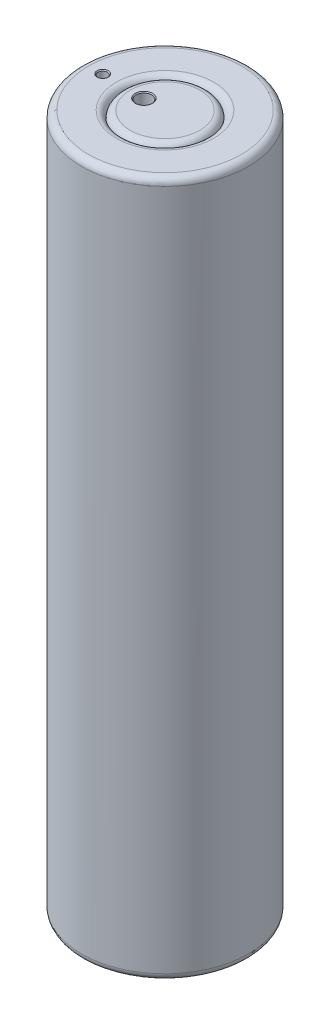
ISO-10303-21;
HEADER;
FILE_DESCRIPTION(('STEP AP214'),'2;1');
FILE_NAME('part.step','',(''),(''),'','','');
FILE_SCHEMA(('AUTOMOTIVE_DESIGN { 1 0 10303 214 1 1 1 1 }'));
ENDSEC;
DATA;
#1=APPLICATION_CONTEXT('core data for automotive mechanical design processes');
#2=APPLICATION_PROTOCOL_DEFINITION('international standard','automotive_design',2000,#1);
#3=PRODUCT_CONTEXT('',#1,'mechanical');
#4=PRODUCT('Part','Part','',(#3));
#5=PRODUCT_RELATED_PRODUCT_CATEGORY('part','',(#4));
#6=PRODUCT_DEFINITION_FORMATION('','',#4);
#7=PRODUCT_DEFINITION_CONTEXT('part definition',#1,'design');
#8=PRODUCT_DEFINITION('design','',#6,#7);
#9=PRODUCT_DEFINITION_SHAPE('','',#8);
#10=(LENGTH_UNIT() NAMED_UNIT(*) SI_UNIT(.MILLI.,.METRE.));
#11=(NAMED_UNIT(*) PLANE_ANGLE_UNIT() SI_UNIT($,.RADIAN.));
#12=(NAMED_UNIT(*) SI_UNIT($,.STERADIAN.) SOLID_ANGLE_UNIT());
#13=UNCERTAINTY_MEASURE_WITH_UNIT(LENGTH_MEASURE(1.E-05),#10,'distance_accuracy_value','');
#14=(GEOMETRIC_REPRESENTATION_CONTEXT(3) GLOBAL_UNCERTAINTY_ASSIGNED_CONTEXT((#13)) GLOBAL_UNIT_ASSIGNED_CONTEXT((#10,
#11,#12)) REPRESENTATION_CONTEXT('',''));
#15=CARTESIAN_POINT('',(0.,0.,0.));
#16=DIRECTION('',(0.,0.,1.));
#17=DIRECTION('',(1.,0.,0.));
#18=AXIS2_PLACEMENT_3D('',#15,#16,#17);
#19=CARTESIAN_POINT('',(0.,-477.667682926829,47.165975045167));
#20=DIRECTION('',(0.,1.,0.));
#21=DIRECTION('',(0.,0.,1.));
#22=AXIS2_PLACEMENT_3D('',#19,#20,#21);
#23=PLANE('',#22);
#24=CARTESIAN_POINT('',(0.,-477.667682926829,-12.834024954833));
#25=DIRECTION('',(0.,1.,0.));
#26=DIRECTION('',(0.,0.,1.));
#27=AXIS2_PLACEMENT_3D('',#24,#25,#26);
#28=CIRCLE('',#27,35.);
#29=CARTESIAN_POINT('',(0.,-477.667682926829,22.165975045167));
#30=VERTEX_POINT('',#29);
#31=EDGE_CURVE('E42',#30,#30,#28,.T.);
#32=ORIENTED_EDGE('',*,*,#31,.T.);
#33=EDGE_LOOP('',(#32));
#34=FACE_BOUND('',#33,.T.);
#35=CARTESIAN_POINT('',(0.,-477.667682926829,-12.834024954833));
#36=DIRECTION('',(0.,1.,0.));
#37=DIRECTION('',(0.,0.,1.));
#38=AXIS2_PLACEMENT_3D('',#35,#36,#37);
#39=CIRCLE('',#38,54.9999999999999);
#40=CARTESIAN_POINT('',(0.,-477.667682926829,42.165975045167));
#41=VERTEX_POINT('',#40);
#42=EDGE_CURVE('E46',#41,#41,#39,.F.);
#43=ORIENTED_EDGE('',*,*,#42,.T.);
#44=EDGE_LOOP('',(#43));
#45=FACE_BOUND('',#44,.T.);
#46=CARTESIAN_POINT('',(-44.9995193019944,-477.667682926829,-13.042021564013));
#47=DIRECTION('',(0.,-1.,0.));
#48=DIRECTION('',(0.,0.,-1.));
#49=AXIS2_PLACEMENT_3D('',#46,#47,#48);
#50=CIRCLE('',#49,7.38124);
#51=CARTESIAN_POINT('',(-44.9995193019944,-477.667682926829,-20.423261564013));
#52=VERTEX_POINT('',#51);
#53=EDGE_CURVE('E106',#52,#52,#50,.T.);
#54=ORIENTED_EDGE('',*,*,#53,.F.);
#55=EDGE_LOOP('',(#54));
#56=FACE_BOUND('',#55,.T.);
#57=CARTESIAN_POINT('',(44.9953549291329,-477.667682926829,-12.1874688463979));
#58=DIRECTION('',(0.,-1.,0.));
#59=DIRECTION('',(0.,0.,-1.));
#60=AXIS2_PLACEMENT_3D('',#57,#58,#59);
#61=CIRCLE('',#60,4.0132);
#62=CARTESIAN_POINT('',(44.9953549291329,-477.667682926829,-16.2006688463979));
#63=VERTEX_POINT('',#62);
#64=EDGE_CURVE('E133',#63,#63,#61,.T.);
#65=ORIENTED_EDGE('',*,*,#64,.F.);
#66=EDGE_LOOP('',(#65));
#67=FACE_BOUND('',#66,.T.);
#68=ADVANCED_FACE('F35',(#34,#45,#56,#67),#23,.F.);
#69=CARTESIAN_POINT('',(0.,-472.667682926829,-12.834024954833));
#70=DIRECTION('',(0.,-1.,0.));
#71=DIRECTION('',(0.,0.,-1.));
#72=AXIS2_PLACEMENT_3D('',#69,#70,#71);
#73=CYLINDRICAL_SURFACE('',#72,55.9999999999999);
#74=CARTESIAN_POINT('',(0.,-467.667682926829,-12.8340249548329));
#75=DIRECTION('',(0.,-1.,0.));
#76=DIRECTION('',(0.,0.,-1.));
#77=AXIS2_PLACEMENT_3D('',#74,#75,#76);
#78=CIRCLE('',#77,56.);
#79=CARTESIAN_POINT('',(0.,-467.667682926829,-68.8340249548329));
#80=VERTEX_POINT('',#79);
#81=EDGE_CURVE('E88',#80,#80,#78,.T.);
#82=ORIENTED_EDGE('',*,*,#81,.T.);
#83=EDGE_LOOP('',(#82));
#84=FACE_BOUND('',#83,.T.);
#85=CARTESIAN_POINT('',(0.,12.3323170731707,-12.8340249548329));
#86=DIRECTION('',(0.,-1.,0.));
#87=DIRECTION('',(0.,0.,-1.));
#88=AXIS2_PLACEMENT_3D('',#85,#86,#87);
#89=CIRCLE('',#88,55.9999999999999);
#90=CARTESIAN_POINT('',(0.,12.3323170731707,-68.8340249548328));
#91=VERTEX_POINT('',#90);
#92=EDGE_CURVE('E79',#91,#91,#89,.T.);
#93=ORIENTED_EDGE('',*,*,#92,.F.);
#94=EDGE_LOOP('',(#93));
#95=FACE_BOUND('',#94,.T.);
#96=ADVANCED_FACE('F140',(#84,#95),#73,.F.);
#97=CARTESIAN_POINT('',(0.,12.3323170731707,43.1659750451671));
#98=DIRECTION('',(0.,-1.,0.));
#99=DIRECTION('',(0.,0.,-1.));
#100=AXIS2_PLACEMENT_3D('',#97,#98,#99);
#101=PLANE('',#100);
#102=CARTESIAN_POINT('',(-44.9995193019944,12.3323170731707,-13.0420215640129));
#103=DIRECTION('',(0.,-1.,0.));
#104=DIRECTION('',(0.,0.,-1.));
#105=AXIS2_PLACEMENT_3D('',#102,#103,#104);
#106=CIRCLE('',#105,3.3782);
#107=CARTESIAN_POINT('',(-44.9995193019944,12.3323170731707,-16.4202215640129));
#108=VERTEX_POINT('',#107);
#109=EDGE_CURVE('E118',#108,#108,#106,.T.);
#110=ORIENTED_EDGE('',*,*,#109,.F.);
#111=EDGE_LOOP('',(#110));
#112=FACE_BOUND('',#111,.T.);
#113=ORIENTED_EDGE('',*,*,#92,.T.);
#114=EDGE_LOOP('',(#113));
#115=FACE_BOUND('',#114,.T.);
#116=CARTESIAN_POINT('',(0.,12.3323170731707,-12.8340249548329));
#117=DIRECTION('',(0.,-1.,0.));
#118=DIRECTION('',(0.,0.,-1.));
#119=AXIS2_PLACEMENT_3D('',#116,#117,#118);
#120=CIRCLE('',#119,34.);
#121=CARTESIAN_POINT('',(0.,12.3323170731707,-46.8340249548329));
#122=VERTEX_POINT('',#121);
#123=EDGE_CURVE('E82',#122,#122,#120,.T.);
#124=ORIENTED_EDGE('',*,*,#123,.F.);
#125=EDGE_LOOP('',(#124));
#126=FACE_BOUND('',#125,.T.);
#127=ADVANCED_FACE('F145',(#112,#115,#126),#101,.T.);
#128=CARTESIAN_POINT('',(0.,-472.667682926829,-12.834024954833));
#129=DIRECTION('',(0.,-1.,0.));
#130=DIRECTION('',(0.,0.,-1.));
#131=AXIS2_PLACEMENT_3D('',#128,#129,#130);
#132=CYLINDRICAL_SURFACE('',#131,34.);
#133=ORIENTED_EDGE('',*,*,#123,.T.);
#134=EDGE_LOOP('',(#133));
#135=FACE_BOUND('',#134,.T.);
#136=CARTESIAN_POINT('',(0.,-467.667682926829,-12.8340249548329));
#137=DIRECTION('',(0.,-1.,0.));
#138=DIRECTION('',(0.,0.,-1.));
#139=AXIS2_PLACEMENT_3D('',#136,#137,#138);
#140=CIRCLE('',#139,34.);
#141=CARTESIAN_POINT('',(0.,-467.667682926829,-46.834024954833));
#142=VERTEX_POINT('',#141);
#143=EDGE_CURVE('E85',#142,#142,#140,.T.);
#144=ORIENTED_EDGE('',*,*,#143,.F.);
#145=EDGE_LOOP('',(#144));
#146=FACE_BOUND('',#145,.T.);
#147=ADVANCED_FACE('F236',(#135,#146),#132,.T.);
#148=CARTESIAN_POINT('',(0.,-467.667682926829,43.165975045167));
#149=DIRECTION('',(0.,1.,0.));
#150=DIRECTION('',(0.,0.,1.));
#151=AXIS2_PLACEMENT_3D('',#148,#149,#150);
#152=PLANE('',#151);
#153=CARTESIAN_POINT('',(44.9953549291329,-467.667682926829,-12.1874688463979));
#154=DIRECTION('',(0.,1.,0.));
#155=DIRECTION('',(0.,0.,1.));
#156=AXIS2_PLACEMENT_3D('',#153,#154,#155);
#157=CIRCLE('',#156,3.3782);
#158=CARTESIAN_POINT('',(44.9953549291329,-467.667682926829,-8.80926884639788));
#159=VERTEX_POINT('',#158);
#160=EDGE_CURVE('E127',#159,#159,#157,.T.);
#161=ORIENTED_EDGE('',*,*,#160,.F.);
#162=EDGE_LOOP('',(#161));
#163=FACE_BOUND('',#162,.T.);
#164=CARTESIAN_POINT('',(-44.9995193019944,-467.667682926829,-13.042021564013));
#165=DIRECTION('',(0.,1.,0.));
#166=DIRECTION('',(0.,0.,1.));
#167=AXIS2_PLACEMENT_3D('',#164,#165,#166);
#168=CIRCLE('',#167,6.74624);
#169=CARTESIAN_POINT('',(-44.9995193019944,-467.667682926829,-6.29578156401303));
#170=VERTEX_POINT('',#169);
#171=EDGE_CURVE('E100',#170,#170,#168,.T.);
#172=ORIENTED_EDGE('',*,*,#171,.F.);
#173=EDGE_LOOP('',(#172));
#174=FACE_BOUND('',#173,.T.);
#175=ORIENTED_EDGE('',*,*,#143,.T.);
#176=EDGE_LOOP('',(#175));
#177=FACE_BOUND('',#176,.T.);
#178=ORIENTED_EDGE('',*,*,#81,.F.);
#179=EDGE_LOOP('',(#178));
#180=FACE_BOUND('',#179,.T.);
#181=ADVANCED_FACE('F222',(#163,#174,#177,#180),#152,.T.);
#182=CARTESIAN_POINT('',(-44.9995193019944,-477.667682926829,-13.042021564013));
#183=DIRECTION('',(0.,-1.,0.));
#184=DIRECTION('',(0.,0.,-1.));
#185=AXIS2_PLACEMENT_3D('',#182,#183,#184);
#186=CYLINDRICAL_SURFACE('',#185,6.74624);
#187=CARTESIAN_POINT('',(-44.9995193019944,-477.032682926829,-13.042021564013));
#188=DIRECTION('',(0.,-1.,0.));
#189=DIRECTION('',(0.,0.,-1.));
#190=AXIS2_PLACEMENT_3D('',#187,#188,#189);
#191=CIRCLE('',#190,6.74624);
#192=CARTESIAN_POINT('',(-44.9995193019944,-477.032682926829,-19.788261564013));
#193=VERTEX_POINT('',#192);
#194=EDGE_CURVE('E103',#193,#193,#191,.T.);
#195=ORIENTED_EDGE('',*,*,#194,.T.);
#196=EDGE_LOOP('',(#195));
#197=FACE_BOUND('',#196,.T.);
#198=ORIENTED_EDGE('',*,*,#171,.T.);
#199=EDGE_LOOP('',(#198));
#200=FACE_BOUND('',#199,.T.);
#201=ADVANCED_FACE('F216',(#197,#200),#186,.F.);
#202=CARTESIAN_POINT('',(-44.9995193019944,-477.667682926829,-13.042021564013));
#203=DIRECTION('',(0.,-1.,0.));
#204=DIRECTION('',(0.,0.,-1.));
#205=AXIS2_PLACEMENT_3D('',#202,#203,#204);
#206=CONICAL_SURFACE('',#205,7.38124,0.785398163397448);
#207=ORIENTED_EDGE('',*,*,#194,.F.);
#208=EDGE_LOOP('',(#207));
#209=FACE_BOUND('',#208,.T.);
#210=ORIENTED_EDGE('',*,*,#53,.T.);
#211=EDGE_LOOP('',(#210));
#212=FACE_BOUND('',#211,.T.);
#213=ADVANCED_FACE('F173',(#209,#212),#206,.F.);
#214=CARTESIAN_POINT('',(0.,-467.667682926829,-12.8340249548329));
#215=DIRECTION('',(0.,1.,0.));
#216=DIRECTION('',(0.,0.,1.));
#217=AXIS2_PLACEMENT_3D('',#214,#215,#216);
#218=PLANE('',#217);
#219=CARTESIAN_POINT('',(-14.9984516430443,-467.667682926829,-13.0495436576446));
#220=DIRECTION('',(0.,1.,0.));
#221=DIRECTION('',(0.,0.,1.));
#222=AXIS2_PLACEMENT_3D('',#219,#220,#221);
#223=CIRCLE('',#222,5.5626);
#224=CARTESIAN_POINT('',(-14.9984516430443,-467.667682926829,-7.48694365764464));
#225=VERTEX_POINT('',#224);
#226=EDGE_CURVE('E109',#225,#225,#223,.T.);
#227=ORIENTED_EDGE('',*,*,#226,.F.);
#228=EDGE_LOOP('',(#227));
#229=FACE_BOUND('',#228,.T.);
#230=CARTESIAN_POINT('',(0.,-467.667682926829,-12.8340249548329));
#231=DIRECTION('',(0.,1.,0.));
#232=DIRECTION('',(0.,0.,1.));
#233=AXIS2_PLACEMENT_3D('',#230,#231,#232);
#234=CIRCLE('',#233,26.);
#235=CARTESIAN_POINT('',(0.,-467.667682926829,13.165975045167));
#236=VERTEX_POINT('',#235);
#237=EDGE_CURVE('E73',#236,#236,#234,.T.);
#238=ORIENTED_EDGE('',*,*,#237,.T.);
#239=EDGE_LOOP('',(#238));
#240=FACE_BOUND('',#239,.T.);
#241=ADVANCED_FACE('F169',(#229,#240),#218,.T.);
#242=CARTESIAN_POINT('',(0.,-467.667682926829,-12.8340249548329));
#243=DIRECTION('',(0.,1.,0.));
#244=DIRECTION('',(0.,0.,1.));
#245=AXIS2_PLACEMENT_3D('',#242,#243,#244);
#246=CYLINDRICAL_SURFACE('',#245,26.);
#247=CARTESIAN_POINT('',(0.,12.3323170731707,-12.8340249548329));
#248=DIRECTION('',(0.,1.,0.));
#249=DIRECTION('',(0.,0.,1.));
#250=AXIS2_PLACEMENT_3D('',#247,#248,#249);
#251=CIRCLE('',#250,26.);
#252=CARTESIAN_POINT('',(0.,12.3323170731707,13.1659750451671));
#253=VERTEX_POINT('',#252);
#254=EDGE_CURVE('E76',#253,#253,#251,.T.);
#255=ORIENTED_EDGE('',*,*,#254,.T.);
#256=EDGE_LOOP('',(#255));
#257=FACE_BOUND('',#256,.T.);
#258=ORIENTED_EDGE('',*,*,#237,.F.);
#259=EDGE_LOOP('',(#258));
#260=FACE_BOUND('',#259,.T.);
#261=ADVANCED_FACE('F165',(#257,#260),#246,.F.);
#262=CARTESIAN_POINT('',(0.,12.3323170731707,-12.8340249548329));
#263=DIRECTION('',(0.,-1.,0.));
#264=DIRECTION('',(0.,0.,-1.));
#265=AXIS2_PLACEMENT_3D('',#262,#263,#264);
#266=PLANE('',#265);
#267=CARTESIAN_POINT('',(-14.9989517782276,12.3323170731707,-12.656696010766));
#268=DIRECTION('',(0.,-1.,0.));
#269=DIRECTION('',(0.,0.,-1.));
#270=AXIS2_PLACEMENT_3D('',#267,#268,#269);
#271=CIRCLE('',#270,5.5626);
#272=CARTESIAN_POINT('',(-14.9989517782276,12.3323170731707,-18.219296010766));
#273=VERTEX_POINT('',#272);
#274=EDGE_CURVE('E91',#273,#273,#271,.T.);
#275=ORIENTED_EDGE('',*,*,#274,.F.);
#276=EDGE_LOOP('',(#275));
#277=FACE_BOUND('',#276,.T.);
#278=ORIENTED_EDGE('',*,*,#254,.F.);
#279=EDGE_LOOP('',(#278));
#280=FACE_BOUND('',#279,.T.);
#281=ADVANCED_FACE('F161',(#277,#280),#266,.T.);
#282=CARTESIAN_POINT('',(-14.9989517782276,22.3323170731707,-12.656696010766));
#283=DIRECTION('',(0.,1.,0.));
#284=DIRECTION('',(0.,0.,1.));
#285=AXIS2_PLACEMENT_3D('',#282,#283,#284);
#286=CYLINDRICAL_SURFACE('',#285,5.5626);
#287=CARTESIAN_POINT('',(-14.9989517782276,21.6973170731707,-12.656696010766));
#288=DIRECTION('',(0.,1.,0.));
#289=DIRECTION('',(0.,0.,1.));
#290=AXIS2_PLACEMENT_3D('',#287,#288,#289);
#291=CIRCLE('',#290,5.5626);
#292=CARTESIAN_POINT('',(-14.9989517782276,21.6973170731707,-7.09409601076597));
#293=VERTEX_POINT('',#292);
#294=EDGE_CURVE('E94',#293,#293,#291,.T.);
#295=ORIENTED_EDGE('',*,*,#294,.T.);
#296=EDGE_LOOP('',(#295));
#297=FACE_BOUND('',#296,.T.);
#298=ORIENTED_EDGE('',*,*,#274,.T.);
#299=EDGE_LOOP('',(#298));
#300=FACE_BOUND('',#299,.T.);
#301=ADVANCED_FACE('F164',(#297,#300),#286,.F.);
#302=CARTESIAN_POINT('',(-14.9989517782276,22.3323170731707,-12.656696010766));
#303=DIRECTION('',(0.,1.,0.));
#304=DIRECTION('',(0.,0.,1.));
#305=AXIS2_PLACEMENT_3D('',#302,#303,#304);
#306=CONICAL_SURFACE('',#305,6.1976,0.785398163397451);
#307=ORIENTED_EDGE('',*,*,#294,.F.);
#308=EDGE_LOOP('',(#307));
#309=FACE_BOUND('',#308,.T.);
#310=CARTESIAN_POINT('',(-14.9989517782276,22.3323170731707,-12.656696010766));
#311=DIRECTION('',(0.,1.,0.));
#312=DIRECTION('',(0.,0.,1.));
#313=AXIS2_PLACEMENT_3D('',#310,#311,#312);
#314=CIRCLE('',#313,6.1976);
#315=CARTESIAN_POINT('',(-14.9989517782276,22.3323170731707,-6.45909601076597));
#316=VERTEX_POINT('',#315);
#317=EDGE_CURVE('E97',#316,#316,#314,.T.);
#318=ORIENTED_EDGE('',*,*,#317,.T.);
#319=EDGE_LOOP('',(#318));
#320=FACE_BOUND('',#319,.T.);
#321=ADVANCED_FACE('F159',(#309,#320),#306,.F.);
#322=CARTESIAN_POINT('',(0.,22.3323170731707,17.1659750451671));
#323=DIRECTION('',(0.,1.,0.));
#324=DIRECTION('',(0.,0.,1.));
#325=AXIS2_PLACEMENT_3D('',#322,#323,#324);
#326=PLANE('',#325);
#327=ORIENTED_EDGE('',*,*,#317,.F.);
#328=EDGE_LOOP('',(#327));
#329=FACE_BOUND('',#328,.T.);
#330=CARTESIAN_POINT('',(0.,22.3323170731707,-12.8340249548329));
#331=DIRECTION('',(0.,1.,0.));
#332=DIRECTION('',(0.,0.,1.));
#333=AXIS2_PLACEMENT_3D('',#330,#331,#332);
#334=CIRCLE('',#333,25.);
#335=CARTESIAN_POINT('',(0.,22.3323170731707,12.1659750451671));
#336=VERTEX_POINT('',#335);
#337=EDGE_CURVE('E70',#336,#336,#334,.T.);
#338=ORIENTED_EDGE('',*,*,#337,.T.);
#339=EDGE_LOOP('',(#338));
#340=FACE_BOUND('',#339,.T.);
#341=ADVANCED_FACE('F156',(#329,#340),#326,.T.);
#342=CARTESIAN_POINT('',(0.,17.3323170731707,-12.8340249548329));
#343=DIRECTION('',(0.,1.,0.));
#344=DIRECTION('',(0.,0.,1.));
#345=AXIS2_PLACEMENT_3D('',#342,#343,#344);
#346=TOROIDAL_SURFACE('',#345,25.,5.);
#347=CARTESIAN_POINT('',(0.,17.3323170731707,-12.8340249548329));
#348=DIRECTION('',(0.,1.,0.));
#349=DIRECTION('',(0.,0.,1.));
#350=AXIS2_PLACEMENT_3D('',#347,#348,#349);
#351=CIRCLE('',#350,30.);
#352=CARTESIAN_POINT('',(0.,17.3323170731707,17.1659750451671));
#353=VERTEX_POINT('',#352);
#354=EDGE_CURVE('E67',#353,#353,#351,.F.);
#355=ORIENTED_EDGE('',*,*,#354,.F.);
#356=EDGE_LOOP('',(#355));
#357=FACE_BOUND('',#356,.T.);
#358=ORIENTED_EDGE('',*,*,#337,.F.);
#359=EDGE_LOOP('',(#358));
#360=FACE_BOUND('',#359,.T.);
#361=ADVANCED_FACE('F155',(#357,#360),#346,.T.);
#362=CARTESIAN_POINT('',(0.,-472.667682926829,-12.834024954833));
#363=DIRECTION('',(0.,-1.,0.));
#364=DIRECTION('',(0.,0.,-1.));
#365=AXIS2_PLACEMENT_3D('',#362,#363,#364);
#366=CYLINDRICAL_SURFACE('',#365,59.9999999999999);
#367=CARTESIAN_POINT('',(0.,-472.667682926829,-12.834024954833));
#368=DIRECTION('',(0.,1.,0.));
#369=DIRECTION('',(0.,0.,1.));
#370=AXIS2_PLACEMENT_3D('',#367,#368,#369);
#371=CIRCLE('',#370,59.9999999999999);
#372=CARTESIAN_POINT('',(0.,-472.667682926829,47.165975045167));
#373=VERTEX_POINT('',#372);
#374=EDGE_CURVE('E10',#373,#373,#371,.T.);
#375=ORIENTED_EDGE('',*,*,#374,.T.);
#376=EDGE_LOOP('',(#375));
#377=FACE_BOUND('',#376,.T.);
#378=CARTESIAN_POINT('',(0.,17.3323170731707,-12.8340249548329));
#379=DIRECTION('',(0.,-1.,0.));
#380=DIRECTION('',(0.,0.,-1.));
#381=AXIS2_PLACEMENT_3D('',#378,#379,#380);
#382=CIRCLE('',#381,59.9999999999999);
#383=CARTESIAN_POINT('',(0.,17.3323170731707,-72.8340249548328));
#384=VERTEX_POINT('',#383);
#385=EDGE_CURVE('E58',#384,#384,#382,.T.);
#386=ORIENTED_EDGE('',*,*,#385,.T.);
#387=EDGE_LOOP('',(#386));
#388=FACE_BOUND('',#387,.T.);
#389=ADVANCED_FACE('F152',(#377,#388),#366,.T.);
#390=CARTESIAN_POINT('',(0.,22.3323170731707,47.1659750451671));
#391=DIRECTION('',(0.,-1.,0.));
#392=DIRECTION('',(0.,0.,-1.));
#393=AXIS2_PLACEMENT_3D('',#390,#391,#392);
#394=PLANE('',#393);
#395=CARTESIAN_POINT('',(-44.9995193019944,22.3323170731707,-13.0420215640129));
#396=DIRECTION('',(0.,1.,0.));
#397=DIRECTION('',(0.,0.,1.));
#398=AXIS2_PLACEMENT_3D('',#395,#396,#397);
#399=CIRCLE('',#398,4.0132);
#400=CARTESIAN_POINT('',(-44.9995193019944,22.3323170731707,-9.02882156401294));
#401=VERTEX_POINT('',#400);
#402=EDGE_CURVE('E124',#401,#401,#399,.T.);
#403=ORIENTED_EDGE('',*,*,#402,.F.);
#404=EDGE_LOOP('',(#403));
#405=FACE_BOUND('',#404,.T.);
#406=CARTESIAN_POINT('',(0.,22.3323170731707,-12.8340249548329));
#407=DIRECTION('',(0.,-1.,0.));
#408=DIRECTION('',(0.,0.,-1.));
#409=AXIS2_PLACEMENT_3D('',#406,#407,#408);
#410=CIRCLE('',#409,54.9999999999999);
#411=CARTESIAN_POINT('',(0.,22.3323170731707,-67.8340249548328));
#412=VERTEX_POINT('',#411);
#413=EDGE_CURVE('E50',#412,#412,#410,.F.);
#414=ORIENTED_EDGE('',*,*,#413,.T.);
#415=EDGE_LOOP('',(#414));
#416=FACE_BOUND('',#415,.T.);
#417=CARTESIAN_POINT('',(0.,22.3323170731707,-12.8340249548329));
#418=DIRECTION('',(0.,-1.,0.));
#419=DIRECTION('',(0.,0.,-1.));
#420=AXIS2_PLACEMENT_3D('',#417,#418,#419);
#421=CIRCLE('',#420,35.);
#422=CARTESIAN_POINT('',(0.,22.3323170731707,-47.8340249548329));
#423=VERTEX_POINT('',#422);
#424=EDGE_CURVE('E55',#423,#423,#421,.T.);
#425=ORIENTED_EDGE('',*,*,#424,.T.);
#426=EDGE_LOOP('',(#425));
#427=FACE_BOUND('',#426,.T.);
#428=ADVANCED_FACE('F151',(#405,#416,#427),#394,.F.);
#429=CARTESIAN_POINT('',(0.,-477.667682926829,17.165975045167));
#430=DIRECTION('',(0.,-1.,0.));
#431=DIRECTION('',(0.,0.,-1.));
#432=AXIS2_PLACEMENT_3D('',#429,#430,#431);
#433=PLANE('',#432);
#434=CARTESIAN_POINT('',(-14.9984516430443,-477.667682926829,-13.0495436576446));
#435=DIRECTION('',(0.,-1.,0.));
#436=DIRECTION('',(0.,0.,-1.));
#437=AXIS2_PLACEMENT_3D('',#434,#435,#436);
#438=CIRCLE('',#437,6.1976);
#439=CARTESIAN_POINT('',(-14.9984516430443,-477.667682926829,-19.2471436576446));
#440=VERTEX_POINT('',#439);
#441=EDGE_CURVE('E115',#440,#440,#438,.T.);
#442=ORIENTED_EDGE('',*,*,#441,.F.);
#443=EDGE_LOOP('',(#442));
#444=FACE_BOUND('',#443,.T.);
#445=CARTESIAN_POINT('',(0.,-477.667682926829,-12.8340249548329));
#446=DIRECTION('',(0.,-1.,0.));
#447=DIRECTION('',(0.,0.,-1.));
#448=AXIS2_PLACEMENT_3D('',#445,#446,#447);
#449=CIRCLE('',#448,25.);
#450=CARTESIAN_POINT('',(0.,-477.667682926829,-37.8340249548329));
#451=VERTEX_POINT('',#450);
#452=EDGE_CURVE('E61',#451,#451,#449,.T.);
#453=ORIENTED_EDGE('',*,*,#452,.T.);
#454=EDGE_LOOP('',(#453));
#455=FACE_BOUND('',#454,.T.);
#456=ADVANCED_FACE('F175',(#444,#455),#433,.T.);
#457=CARTESIAN_POINT('',(0.,-472.667682926829,-12.8340249548329));
#458=DIRECTION('',(0.,-1.,0.));
#459=DIRECTION('',(0.,0.,-1.));
#460=AXIS2_PLACEMENT_3D('',#457,#458,#459);
#461=TOROIDAL_SURFACE('',#460,25.,5.);
#462=ORIENTED_EDGE('',*,*,#452,.F.);
#463=EDGE_LOOP('',(#462));
#464=FACE_BOUND('',#463,.T.);
#465=CARTESIAN_POINT('',(0.,-472.667682926829,-12.8340249548329));
#466=DIRECTION('',(0.,-1.,0.));
#467=DIRECTION('',(0.,0.,-1.));
#468=AXIS2_PLACEMENT_3D('',#465,#466,#467);
#469=CIRCLE('',#468,30.);
#470=CARTESIAN_POINT('',(0.,-472.667682926829,-42.8340249548329));
#471=VERTEX_POINT('',#470);
#472=EDGE_CURVE('E64',#471,#471,#469,.F.);
#473=ORIENTED_EDGE('',*,*,#472,.F.);
#474=EDGE_LOOP('',(#473));
#475=FACE_BOUND('',#474,.T.);
#476=ADVANCED_FACE('F178',(#464,#475),#461,.T.);
#477=CARTESIAN_POINT('',(0.,17.3323170731707,-12.8340249548329));
#478=DIRECTION('',(0.,-1.,0.));
#479=DIRECTION('',(0.,0.,-1.));
#480=AXIS2_PLACEMENT_3D('',#477,#478,#479);
#481=TOROIDAL_SURFACE('',#480,54.9999999999999,5.);
#482=ORIENTED_EDGE('',*,*,#413,.F.);
#483=EDGE_LOOP('',(#482));
#484=FACE_BOUND('',#483,.T.);
#485=ORIENTED_EDGE('',*,*,#385,.F.);
#486=EDGE_LOOP('',(#485));
#487=FACE_BOUND('',#486,.T.);
#488=ADVANCED_FACE('F185',(#484,#487),#481,.T.);
#489=CARTESIAN_POINT('',(0.,17.3323170731707,-12.8340249548329));
#490=DIRECTION('',(0.,-1.,0.));
#491=DIRECTION('',(0.,0.,-1.));
#492=AXIS2_PLACEMENT_3D('',#489,#490,#491);
#493=TOROIDAL_SURFACE('',#492,35.,5.);
#494=ORIENTED_EDGE('',*,*,#354,.T.);
#495=EDGE_LOOP('',(#494));
#496=FACE_BOUND('',#495,.T.);
#497=ORIENTED_EDGE('',*,*,#424,.F.);
#498=EDGE_LOOP('',(#497));
#499=FACE_BOUND('',#498,.T.);
#500=ADVANCED_FACE('F189',(#496,#499),#493,.T.);
#501=CARTESIAN_POINT('',(0.,-472.667682926829,-12.834024954833));
#502=DIRECTION('',(0.,1.,0.));
#503=DIRECTION('',(0.,0.,1.));
#504=AXIS2_PLACEMENT_3D('',#501,#502,#503);
#505=TOROIDAL_SURFACE('',#504,35.,5.);
#506=ORIENTED_EDGE('',*,*,#31,.F.);
#507=EDGE_LOOP('',(#506));
#508=FACE_BOUND('',#507,.T.);
#509=ORIENTED_EDGE('',*,*,#472,.T.);
#510=EDGE_LOOP('',(#509));
#511=FACE_BOUND('',#510,.T.);
#512=ADVANCED_FACE('F192',(#508,#511),#505,.T.);
#513=CARTESIAN_POINT('',(0.,-472.667682926829,-12.834024954833));
#514=DIRECTION('',(0.,1.,0.));
#515=DIRECTION('',(0.,0.,1.));
#516=AXIS2_PLACEMENT_3D('',#513,#514,#515);
#517=TOROIDAL_SURFACE('',#516,54.9999999999999,5.);
#518=ORIENTED_EDGE('',*,*,#374,.F.);
#519=EDGE_LOOP('',(#518));
#520=FACE_BOUND('',#519,.T.);
#521=ORIENTED_EDGE('',*,*,#42,.F.);
#522=EDGE_LOOP('',(#521));
#523=FACE_BOUND('',#522,.T.);
#524=ADVANCED_FACE('F37',(#520,#523),#517,.T.);
#525=CARTESIAN_POINT('',(-14.9984516430443,-477.667682926829,-13.0495436576446));
#526=DIRECTION('',(0.,-1.,0.));
#527=DIRECTION('',(0.,0.,-1.));
#528=AXIS2_PLACEMENT_3D('',#525,#526,#527);
#529=CYLINDRICAL_SURFACE('',#528,5.5626);
#530=CARTESIAN_POINT('',(-14.9984516430443,-477.032682926829,-13.0495436576446));
#531=DIRECTION('',(0.,-1.,0.));
#532=DIRECTION('',(0.,0.,-1.));
#533=AXIS2_PLACEMENT_3D('',#530,#531,#532);
#534=CIRCLE('',#533,5.5626);
#535=CARTESIAN_POINT('',(-14.9984516430443,-477.032682926829,-18.6121436576446));
#536=VERTEX_POINT('',#535);
#537=EDGE_CURVE('E112',#536,#536,#534,.T.);
#538=ORIENTED_EDGE('',*,*,#537,.T.);
#539=EDGE_LOOP('',(#538));
#540=FACE_BOUND('',#539,.T.);
#541=ORIENTED_EDGE('',*,*,#226,.T.);
#542=EDGE_LOOP('',(#541));
#543=FACE_BOUND('',#542,.T.);
#544=ADVANCED_FACE('F199',(#540,#543),#529,.F.);
#545=CARTESIAN_POINT('',(-14.9984516430443,-477.667682926829,-13.0495436576446));
#546=DIRECTION('',(0.,-1.,0.));
#547=DIRECTION('',(0.,0.,-1.));
#548=AXIS2_PLACEMENT_3D('',#545,#546,#547);
#549=CONICAL_SURFACE('',#548,6.1976,0.785398163397451);
#550=ORIENTED_EDGE('',*,*,#537,.F.);
#551=EDGE_LOOP('',(#550));
#552=FACE_BOUND('',#551,.T.);
#553=ORIENTED_EDGE('',*,*,#441,.T.);
#554=EDGE_LOOP('',(#553));
#555=FACE_BOUND('',#554,.T.);
#556=ADVANCED_FACE('F207',(#552,#555),#549,.F.);
#557=CARTESIAN_POINT('',(-44.9995193019944,22.3323170731707,-13.0420215640129));
#558=DIRECTION('',(0.,1.,0.));
#559=DIRECTION('',(0.,0.,1.));
#560=AXIS2_PLACEMENT_3D('',#557,#558,#559);
#561=CYLINDRICAL_SURFACE('',#560,3.3782);
#562=CARTESIAN_POINT('',(-44.9995193019944,21.6973170731707,-13.0420215640129));
#563=DIRECTION('',(0.,1.,0.));
#564=DIRECTION('',(0.,0.,1.));
#565=AXIS2_PLACEMENT_3D('',#562,#563,#564);
#566=CIRCLE('',#565,3.3782);
#567=CARTESIAN_POINT('',(-44.9995193019944,21.6973170731707,-9.66382156401295));
#568=VERTEX_POINT('',#567);
#569=EDGE_CURVE('E121',#568,#568,#566,.T.);
#570=ORIENTED_EDGE('',*,*,#569,.T.);
#571=EDGE_LOOP('',(#570));
#572=FACE_BOUND('',#571,.T.);
#573=ORIENTED_EDGE('',*,*,#109,.T.);
#574=EDGE_LOOP('',(#573));
#575=FACE_BOUND('',#574,.T.);
#576=ADVANCED_FACE('F257',(#572,#575),#561,.F.);
#577=CARTESIAN_POINT('',(-44.9995193019944,22.3323170731707,-13.0420215640129));
#578=DIRECTION('',(0.,1.,0.));
#579=DIRECTION('',(0.,0.,1.));
#580=AXIS2_PLACEMENT_3D('',#577,#578,#579);
#581=CONICAL_SURFACE('',#580,4.0132,0.785398163397451);
#582=ORIENTED_EDGE('',*,*,#569,.F.);
#583=EDGE_LOOP('',(#582));
#584=FACE_BOUND('',#583,.T.);
#585=ORIENTED_EDGE('',*,*,#402,.T.);
#586=EDGE_LOOP('',(#585));
#587=FACE_BOUND('',#586,.T.);
#588=ADVANCED_FACE('F259',(#584,#587),#581,.F.);
#589=CARTESIAN_POINT('',(44.9953549291329,-477.667682926829,-12.1874688463979));
#590=DIRECTION('',(0.,-1.,0.));
#591=DIRECTION('',(0.,0.,-1.));
#592=AXIS2_PLACEMENT_3D('',#589,#590,#591);
#593=CYLINDRICAL_SURFACE('',#592,3.3782);
#594=CARTESIAN_POINT('',(44.9953549291329,-477.032682926829,-12.1874688463979));
#595=DIRECTION('',(0.,-1.,0.));
#596=DIRECTION('',(0.,0.,-1.));
#597=AXIS2_PLACEMENT_3D('',#594,#595,#596);
#598=CIRCLE('',#597,3.3782);
#599=CARTESIAN_POINT('',(44.9953549291329,-477.032682926829,-15.5656688463979));
#600=VERTEX_POINT('',#599);
#601=EDGE_CURVE('E130',#600,#600,#598,.T.);
#602=ORIENTED_EDGE('',*,*,#601,.T.);
#603=EDGE_LOOP('',(#602));
#604=FACE_BOUND('',#603,.T.);
#605=ORIENTED_EDGE('',*,*,#160,.T.);
#606=EDGE_LOOP('',(#605));
#607=FACE_BOUND('',#606,.T.);
#608=ADVANCED_FACE('F266',(#604,#607),#593,.F.);
#609=CARTESIAN_POINT('',(44.9953549291329,-477.667682926829,-12.1874688463979));
#610=DIRECTION('',(0.,-1.,0.));
#611=DIRECTION('',(0.,0.,-1.));
#612=AXIS2_PLACEMENT_3D('',#609,#610,#611);
#613=CONICAL_SURFACE('',#612,4.0132,0.785398163397454);
#614=ORIENTED_EDGE('',*,*,#601,.F.);
#615=EDGE_LOOP('',(#614));
#616=FACE_BOUND('',#615,.T.);
#617=ORIENTED_EDGE('',*,*,#64,.T.);
#618=EDGE_LOOP('',(#617));
#619=FACE_BOUND('',#618,.T.);
#620=ADVANCED_FACE('F137',(#616,#619),#613,.F.);
#621=CLOSED_SHELL('',(#68,#96,#127,#147,#181,#201,#213,#241,#261,#281,#301,#321,#341,#361,#389,
#428,#456,#476,#488,#500,#512,#524,#544,#556,#576,#588,#608,#620));
#622=MANIFOLD_SOLID_BREP('B2',#621);
#623=ADVANCED_BREP_SHAPE_REPRESENTATION('',(#18,#622),#14);
#624=SHAPE_DEFINITION_REPRESENTATION(#9,#623);
ENDSEC;
END-ISO-10303-21;
